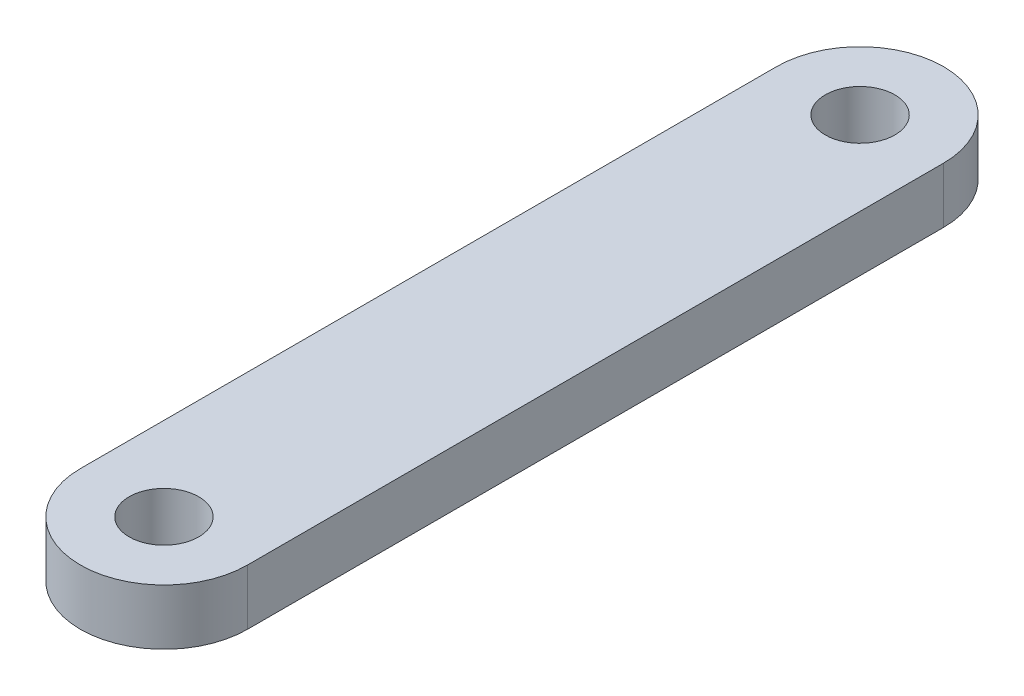
ISO-10303-21;
HEADER;
FILE_DESCRIPTION(('STEP AP214'),'2;1');
FILE_NAME('part.step','',(''),(''),'','','');
FILE_SCHEMA(('AUTOMOTIVE_DESIGN { 1 0 10303 214 1 1 1 1 }'));
ENDSEC;
DATA;
#1=APPLICATION_CONTEXT('core data for automotive mechanical design processes');
#2=APPLICATION_PROTOCOL_DEFINITION('international standard','automotive_design',2000,#1);
#3=PRODUCT_CONTEXT('',#1,'mechanical');
#4=PRODUCT('Part','Part','',(#3));
#5=PRODUCT_RELATED_PRODUCT_CATEGORY('part','',(#4));
#6=PRODUCT_DEFINITION_FORMATION('','',#4);
#7=PRODUCT_DEFINITION_CONTEXT('part definition',#1,'design');
#8=PRODUCT_DEFINITION('design','',#6,#7);
#9=PRODUCT_DEFINITION_SHAPE('','',#8);
#10=(LENGTH_UNIT() NAMED_UNIT(*) SI_UNIT(.MILLI.,.METRE.));
#11=(NAMED_UNIT(*) PLANE_ANGLE_UNIT() SI_UNIT($,.RADIAN.));
#12=(NAMED_UNIT(*) SI_UNIT($,.STERADIAN.) SOLID_ANGLE_UNIT());
#13=UNCERTAINTY_MEASURE_WITH_UNIT(LENGTH_MEASURE(1.E-05),#10,'distance_accuracy_value','');
#14=(GEOMETRIC_REPRESENTATION_CONTEXT(3) GLOBAL_UNCERTAINTY_ASSIGNED_CONTEXT((#13)) GLOBAL_UNIT_ASSIGNED_CONTEXT((#10,
#11,#12)) REPRESENTATION_CONTEXT('',''));
#15=CARTESIAN_POINT('',(0.,0.,0.));
#16=DIRECTION('',(0.,0.,1.));
#17=DIRECTION('',(1.,0.,0.));
#18=AXIS2_PLACEMENT_3D('',#15,#16,#17);
#19=CARTESIAN_POINT('',(0.,8.,0.));
#20=DIRECTION('',(0.,-1.,0.));
#21=DIRECTION('',(0.,0.,-1.));
#22=AXIS2_PLACEMENT_3D('',#19,#20,#21);
#23=PLANE('',#22);
#24=CARTESIAN_POINT('',(0.,8.,0.));
#25=DIRECTION('',(0.,1.,0.));
#26=DIRECTION('',(0.,0.,-1.));
#27=AXIS2_PLACEMENT_3D('',#24,#25,#26);
#28=CIRCLE('',#27,12.);
#29=CARTESIAN_POINT('',(-12.,8.,0.));
#30=VERTEX_POINT('',#29);
#31=CARTESIAN_POINT('',(12.,8.,0.));
#32=VERTEX_POINT('',#31);
#33=EDGE_CURVE('E91',#30,#32,#28,.T.);
#34=ORIENTED_EDGE('',*,*,#33,.T.);
#35=DIRECTION('',(0.,0.,-1.));
#36=VECTOR('',#35,1.);
#37=CARTESIAN_POINT('',(12.,8.,-100.));
#38=LINE('',#37,#36);
#39=CARTESIAN_POINT('',(12.,8.,-100.));
#40=VERTEX_POINT('',#39);
#41=EDGE_CURVE('E86',#32,#40,#38,.T.);
#42=ORIENTED_EDGE('',*,*,#41,.T.);
#43=CARTESIAN_POINT('',(0.,8.,-100.));
#44=DIRECTION('',(0.,1.,0.));
#45=DIRECTION('',(0.,0.,-1.));
#46=AXIS2_PLACEMENT_3D('',#43,#44,#45);
#47=CIRCLE('',#46,12.);
#48=CARTESIAN_POINT('',(-12.,8.,-100.));
#49=VERTEX_POINT('',#48);
#50=EDGE_CURVE('E89',#40,#49,#47,.T.);
#51=ORIENTED_EDGE('',*,*,#50,.T.);
#52=DIRECTION('',(0.,0.,1.));
#53=VECTOR('',#52,1.);
#54=CARTESIAN_POINT('',(-12.,8.,0.));
#55=LINE('',#54,#53);
#56=EDGE_CURVE('E56',#49,#30,#55,.T.);
#57=ORIENTED_EDGE('',*,*,#56,.T.);
#58=EDGE_LOOP('',(#34,#42,#51,#57));
#59=FACE_BOUND('',#58,.T.);
#60=CARTESIAN_POINT('',(0.,8.,0.));
#61=DIRECTION('',(0.,1.,0.));
#62=DIRECTION('',(0.,0.,1.));
#63=AXIS2_PLACEMENT_3D('',#60,#61,#62);
#64=CIRCLE('',#63,5.);
#65=CARTESIAN_POINT('',(0.,8.,5.));
#66=VERTEX_POINT('',#65);
#67=EDGE_CURVE('E106',#66,#66,#64,.T.);
#68=ORIENTED_EDGE('',*,*,#67,.F.);
#69=EDGE_LOOP('',(#68));
#70=FACE_BOUND('',#69,.T.);
#71=CARTESIAN_POINT('',(0.,8.,-100.));
#72=DIRECTION('',(0.,1.,0.));
#73=DIRECTION('',(0.,0.,1.));
#74=AXIS2_PLACEMENT_3D('',#71,#72,#73);
#75=CIRCLE('',#74,5.);
#76=CARTESIAN_POINT('',(0.,8.,-95.));
#77=VERTEX_POINT('',#76);
#78=EDGE_CURVE('E121',#77,#77,#75,.T.);
#79=ORIENTED_EDGE('',*,*,#78,.F.);
#80=EDGE_LOOP('',(#79));
#81=FACE_BOUND('',#80,.T.);
#82=ADVANCED_FACE('F39',(#59,#70,#81),#23,.F.);
#83=CARTESIAN_POINT('',(0.,0.,0.));
#84=DIRECTION('',(0.,-1.,0.));
#85=DIRECTION('',(0.,0.,-1.));
#86=AXIS2_PLACEMENT_3D('',#83,#84,#85);
#87=PLANE('',#86);
#88=CARTESIAN_POINT('',(0.,0.,0.));
#89=DIRECTION('',(0.,1.,0.));
#90=DIRECTION('',(0.,0.,1.));
#91=AXIS2_PLACEMENT_3D('',#88,#89,#90);
#92=CIRCLE('',#91,5.);
#93=CARTESIAN_POINT('',(0.,0.,5.));
#94=VERTEX_POINT('',#93);
#95=EDGE_CURVE('E118',#94,#94,#92,.T.);
#96=ORIENTED_EDGE('',*,*,#95,.T.);
#97=EDGE_LOOP('',(#96));
#98=FACE_BOUND('',#97,.T.);
#99=CARTESIAN_POINT('',(0.,0.,0.));
#100=DIRECTION('',(0.,1.,0.));
#101=DIRECTION('',(0.,0.,-1.));
#102=AXIS2_PLACEMENT_3D('',#99,#100,#101);
#103=CIRCLE('',#102,12.);
#104=CARTESIAN_POINT('',(-12.,0.,0.));
#105=VERTEX_POINT('',#104);
#106=CARTESIAN_POINT('',(12.,0.,0.));
#107=VERTEX_POINT('',#106);
#108=EDGE_CURVE('E103',#105,#107,#103,.T.);
#109=ORIENTED_EDGE('',*,*,#108,.F.);
#110=DIRECTION('',(0.,0.,1.));
#111=VECTOR('',#110,1.);
#112=CARTESIAN_POINT('',(-12.,0.,0.));
#113=LINE('',#112,#111);
#114=CARTESIAN_POINT('',(-12.,0.,-100.));
#115=VERTEX_POINT('',#114);
#116=EDGE_CURVE('E79',#115,#105,#113,.T.);
#117=ORIENTED_EDGE('',*,*,#116,.F.);
#118=CARTESIAN_POINT('',(0.,0.,-100.));
#119=DIRECTION('',(0.,1.,0.));
#120=DIRECTION('',(0.,0.,-1.));
#121=AXIS2_PLACEMENT_3D('',#118,#119,#120);
#122=CIRCLE('',#121,12.);
#123=CARTESIAN_POINT('',(12.,0.,-100.));
#124=VERTEX_POINT('',#123);
#125=EDGE_CURVE('E73',#124,#115,#122,.T.);
#126=ORIENTED_EDGE('',*,*,#125,.F.);
#127=DIRECTION('',(0.,0.,-1.));
#128=VECTOR('',#127,1.);
#129=CARTESIAN_POINT('',(12.,0.,-100.));
#130=LINE('',#129,#128);
#131=EDGE_CURVE('E95',#107,#124,#130,.T.);
#132=ORIENTED_EDGE('',*,*,#131,.F.);
#133=EDGE_LOOP('',(#109,#117,#126,#132));
#134=FACE_BOUND('',#133,.T.);
#135=CARTESIAN_POINT('',(0.,0.,-100.));
#136=DIRECTION('',(0.,1.,0.));
#137=DIRECTION('',(0.,0.,1.));
#138=AXIS2_PLACEMENT_3D('',#135,#136,#137);
#139=CIRCLE('',#138,5.);
#140=CARTESIAN_POINT('',(0.,0.,-95.));
#141=VERTEX_POINT('',#140);
#142=EDGE_CURVE('E124',#141,#141,#139,.T.);
#143=ORIENTED_EDGE('',*,*,#142,.T.);
#144=EDGE_LOOP('',(#143));
#145=FACE_BOUND('',#144,.T.);
#146=ADVANCED_FACE('F114',(#98,#134,#145),#87,.T.);
#147=CARTESIAN_POINT('',(0.,8.,0.));
#148=DIRECTION('',(0.,-1.,0.));
#149=DIRECTION('',(0.,0.,-1.));
#150=AXIS2_PLACEMENT_3D('',#147,#148,#149);
#151=CYLINDRICAL_SURFACE('',#150,12.);
#152=ORIENTED_EDGE('',*,*,#108,.T.);
#153=DIRECTION('',(0.,-1.,0.));
#154=VECTOR('',#153,1.);
#155=CARTESIAN_POINT('',(12.,8.,0.));
#156=LINE('',#155,#154);
#157=EDGE_CURVE('E11',#32,#107,#156,.T.);
#158=ORIENTED_EDGE('',*,*,#157,.F.);
#159=ORIENTED_EDGE('',*,*,#33,.F.);
#160=DIRECTION('',(0.,-1.,0.));
#161=VECTOR('',#160,1.);
#162=CARTESIAN_POINT('',(-12.,8.,0.));
#163=LINE('',#162,#161);
#164=EDGE_CURVE('E99',#30,#105,#163,.T.);
#165=ORIENTED_EDGE('',*,*,#164,.T.);
#166=EDGE_LOOP('',(#152,#158,#159,#165));
#167=FACE_BOUND('',#166,.T.);
#168=ADVANCED_FACE('F41',(#167),#151,.T.);
#169=CARTESIAN_POINT('',(12.,8.,-100.));
#170=DIRECTION('',(-1.,0.,0.));
#171=DIRECTION('',(0.,0.,1.));
#172=AXIS2_PLACEMENT_3D('',#169,#170,#171);
#173=PLANE('',#172);
#174=ORIENTED_EDGE('',*,*,#131,.T.);
#175=DIRECTION('',(0.,-1.,0.));
#176=VECTOR('',#175,1.);
#177=CARTESIAN_POINT('',(12.,8.,-100.));
#178=LINE('',#177,#176);
#179=EDGE_CURVE('E48',#40,#124,#178,.T.);
#180=ORIENTED_EDGE('',*,*,#179,.F.);
#181=ORIENTED_EDGE('',*,*,#41,.F.);
#182=ORIENTED_EDGE('',*,*,#157,.T.);
#183=EDGE_LOOP('',(#174,#180,#181,#182));
#184=FACE_BOUND('',#183,.T.);
#185=ADVANCED_FACE('F94',(#184),#173,.F.);
#186=CARTESIAN_POINT('',(0.,8.,-100.));
#187=DIRECTION('',(0.,-1.,0.));
#188=DIRECTION('',(0.,0.,-1.));
#189=AXIS2_PLACEMENT_3D('',#186,#187,#188);
#190=CYLINDRICAL_SURFACE('',#189,12.);
#191=ORIENTED_EDGE('',*,*,#125,.T.);
#192=DIRECTION('',(0.,-1.,0.));
#193=VECTOR('',#192,1.);
#194=CARTESIAN_POINT('',(-12.,8.,-100.));
#195=LINE('',#194,#193);
#196=EDGE_CURVE('E96',#49,#115,#195,.T.);
#197=ORIENTED_EDGE('',*,*,#196,.F.);
#198=ORIENTED_EDGE('',*,*,#50,.F.);
#199=ORIENTED_EDGE('',*,*,#179,.T.);
#200=EDGE_LOOP('',(#191,#197,#198,#199));
#201=FACE_BOUND('',#200,.T.);
#202=ADVANCED_FACE('F97',(#201),#190,.T.);
#203=CARTESIAN_POINT('',(-12.,8.,0.));
#204=DIRECTION('',(1.,0.,0.));
#205=DIRECTION('',(0.,0.,-1.));
#206=AXIS2_PLACEMENT_3D('',#203,#204,#205);
#207=PLANE('',#206);
#208=ORIENTED_EDGE('',*,*,#116,.T.);
#209=ORIENTED_EDGE('',*,*,#164,.F.);
#210=ORIENTED_EDGE('',*,*,#56,.F.);
#211=ORIENTED_EDGE('',*,*,#196,.T.);
#212=EDGE_LOOP('',(#208,#209,#210,#211));
#213=FACE_BOUND('',#212,.T.);
#214=ADVANCED_FACE('F111',(#213),#207,.F.);
#215=CARTESIAN_POINT('',(0.,8.,0.));
#216=DIRECTION('',(0.,-1.,0.));
#217=DIRECTION('',(0.,0.,-1.));
#218=AXIS2_PLACEMENT_3D('',#215,#216,#217);
#219=CYLINDRICAL_SURFACE('',#218,5.);
#220=ORIENTED_EDGE('',*,*,#67,.T.);
#221=EDGE_LOOP('',(#220));
#222=FACE_BOUND('',#221,.T.);
#223=ORIENTED_EDGE('',*,*,#95,.F.);
#224=EDGE_LOOP('',(#223));
#225=FACE_BOUND('',#224,.T.);
#226=ADVANCED_FACE('F141',(#222,#225),#219,.F.);
#227=CARTESIAN_POINT('',(0.,8.,-100.));
#228=DIRECTION('',(0.,-1.,0.));
#229=DIRECTION('',(0.,0.,-1.));
#230=AXIS2_PLACEMENT_3D('',#227,#228,#229);
#231=CYLINDRICAL_SURFACE('',#230,5.);
#232=ORIENTED_EDGE('',*,*,#78,.T.);
#233=EDGE_LOOP('',(#232));
#234=FACE_BOUND('',#233,.T.);
#235=ORIENTED_EDGE('',*,*,#142,.F.);
#236=EDGE_LOOP('',(#235));
#237=FACE_BOUND('',#236,.T.);
#238=ADVANCED_FACE('F130',(#234,#237),#231,.F.);
#239=CLOSED_SHELL('',(#82,#146,#168,#185,#202,#214,#226,#238));
#240=MANIFOLD_SOLID_BREP('B2',#239);
#241=ADVANCED_BREP_SHAPE_REPRESENTATION('',(#18,#240),#14);
#242=SHAPE_DEFINITION_REPRESENTATION(#9,#241);
ENDSEC;
END-ISO-10303-21;
